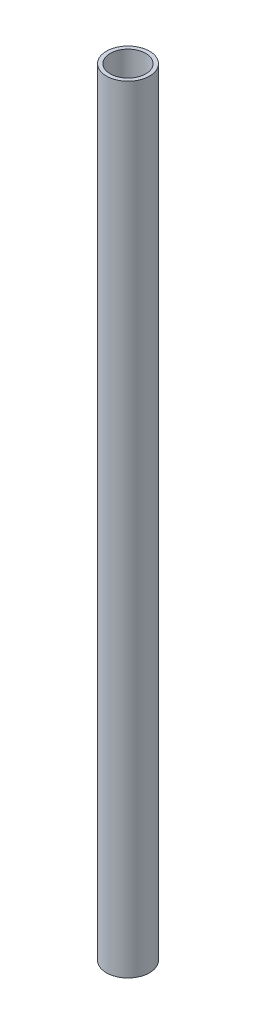
ISO-10303-21;
HEADER;
FILE_DESCRIPTION(('STEP AP214'),'2;1');
FILE_NAME('part.step','',(''),(''),'','','');
FILE_SCHEMA(('AUTOMOTIVE_DESIGN { 1 0 10303 214 1 1 1 1 }'));
ENDSEC;
DATA;
#1=APPLICATION_CONTEXT('core data for automotive mechanical design processes');
#2=APPLICATION_PROTOCOL_DEFINITION('international standard','automotive_design',2000,#1);
#3=PRODUCT_CONTEXT('',#1,'mechanical');
#4=PRODUCT('Part','Part','',(#3));
#5=PRODUCT_RELATED_PRODUCT_CATEGORY('part','',(#4));
#6=PRODUCT_DEFINITION_FORMATION('','',#4);
#7=PRODUCT_DEFINITION_CONTEXT('part definition',#1,'design');
#8=PRODUCT_DEFINITION('design','',#6,#7);
#9=PRODUCT_DEFINITION_SHAPE('','',#8);
#10=(LENGTH_UNIT() NAMED_UNIT(*) SI_UNIT(.MILLI.,.METRE.));
#11=(NAMED_UNIT(*) PLANE_ANGLE_UNIT() SI_UNIT($,.RADIAN.));
#12=(NAMED_UNIT(*) SI_UNIT($,.STERADIAN.) SOLID_ANGLE_UNIT());
#13=UNCERTAINTY_MEASURE_WITH_UNIT(LENGTH_MEASURE(1.E-05),#10,'distance_accuracy_value','');
#14=(GEOMETRIC_REPRESENTATION_CONTEXT(3) GLOBAL_UNCERTAINTY_ASSIGNED_CONTEXT((#13)) GLOBAL_UNIT_ASSIGNED_CONTEXT((#10,
#11,#12)) REPRESENTATION_CONTEXT('',''));
#15=CARTESIAN_POINT('',(0.,0.,0.));
#16=DIRECTION('',(0.,0.,1.));
#17=DIRECTION('',(1.,0.,0.));
#18=AXIS2_PLACEMENT_3D('',#15,#16,#17);
#19=CARTESIAN_POINT('',(0.,457.2,0.));
#20=DIRECTION('',(0.,1.,0.));
#21=DIRECTION('',(0.,0.,1.));
#22=AXIS2_PLACEMENT_3D('',#19,#20,#21);
#23=PLANE('',#22);
#24=CARTESIAN_POINT('',(0.,457.2,0.));
#25=DIRECTION('',(0.,1.,0.));
#26=DIRECTION('',(0.,0.,1.));
#27=AXIS2_PLACEMENT_3D('',#24,#25,#26);
#28=CIRCLE('',#27,12.7);
#29=CARTESIAN_POINT('',(0.,457.2,12.7));
#30=VERTEX_POINT('',#29);
#31=EDGE_CURVE('E10',#30,#30,#28,.T.);
#32=ORIENTED_EDGE('',*,*,#31,.T.);
#33=EDGE_LOOP('',(#32));
#34=FACE_BOUND('',#33,.T.);
#35=CARTESIAN_POINT('',(0.,457.2,0.));
#36=DIRECTION('',(0.,1.,0.));
#37=DIRECTION('',(0.,0.,1.));
#38=AXIS2_PLACEMENT_3D('',#35,#36,#37);
#39=CIRCLE('',#38,10.4648);
#40=CARTESIAN_POINT('',(0.,457.2,10.4648));
#41=VERTEX_POINT('',#40);
#42=EDGE_CURVE('E45',#41,#41,#39,.T.);
#43=ORIENTED_EDGE('',*,*,#42,.F.);
#44=EDGE_LOOP('',(#43));
#45=FACE_BOUND('',#44,.T.);
#46=ADVANCED_FACE('F34',(#34,#45),#23,.T.);
#47=CARTESIAN_POINT('',(0.,0.,0.));
#48=DIRECTION('',(0.,1.,0.));
#49=DIRECTION('',(0.,0.,1.));
#50=AXIS2_PLACEMENT_3D('',#47,#48,#49);
#51=PLANE('',#50);
#52=CARTESIAN_POINT('',(0.,0.,0.));
#53=DIRECTION('',(0.,1.,0.));
#54=DIRECTION('',(0.,0.,1.));
#55=AXIS2_PLACEMENT_3D('',#52,#53,#54);
#56=CIRCLE('',#55,12.7);
#57=CARTESIAN_POINT('',(0.,0.,12.7));
#58=VERTEX_POINT('',#57);
#59=EDGE_CURVE('E38',#58,#58,#56,.T.);
#60=ORIENTED_EDGE('',*,*,#59,.F.);
#61=EDGE_LOOP('',(#60));
#62=FACE_BOUND('',#61,.T.);
#63=CARTESIAN_POINT('',(0.,0.,0.));
#64=DIRECTION('',(0.,1.,0.));
#65=DIRECTION('',(0.,0.,1.));
#66=AXIS2_PLACEMENT_3D('',#63,#64,#65);
#67=CIRCLE('',#66,10.4648);
#68=CARTESIAN_POINT('',(0.,0.,10.4648));
#69=VERTEX_POINT('',#68);
#70=EDGE_CURVE('E47',#69,#69,#67,.T.);
#71=ORIENTED_EDGE('',*,*,#70,.T.);
#72=EDGE_LOOP('',(#71));
#73=FACE_BOUND('',#72,.T.);
#74=ADVANCED_FACE('F57',(#62,#73),#51,.F.);
#75=CARTESIAN_POINT('',(0.,457.2,0.));
#76=DIRECTION('',(0.,-1.,0.));
#77=DIRECTION('',(0.,0.,-1.));
#78=AXIS2_PLACEMENT_3D('',#75,#76,#77);
#79=CYLINDRICAL_SURFACE('',#78,12.7);
#80=ORIENTED_EDGE('',*,*,#31,.F.);
#81=EDGE_LOOP('',(#80));
#82=FACE_BOUND('',#81,.T.);
#83=ORIENTED_EDGE('',*,*,#59,.T.);
#84=EDGE_LOOP('',(#83));
#85=FACE_BOUND('',#84,.T.);
#86=ADVANCED_FACE('F36',(#82,#85),#79,.T.);
#87=CARTESIAN_POINT('',(0.,457.2,0.));
#88=DIRECTION('',(0.,-1.,0.));
#89=DIRECTION('',(0.,0.,-1.));
#90=AXIS2_PLACEMENT_3D('',#87,#88,#89);
#91=CYLINDRICAL_SURFACE('',#90,10.4648);
#92=ORIENTED_EDGE('',*,*,#42,.T.);
#93=EDGE_LOOP('',(#92));
#94=FACE_BOUND('',#93,.T.);
#95=ORIENTED_EDGE('',*,*,#70,.F.);
#96=EDGE_LOOP('',(#95));
#97=FACE_BOUND('',#96,.T.);
#98=ADVANCED_FACE('F53',(#94,#97),#91,.F.);
#99=CLOSED_SHELL('',(#46,#74,#86,#98));
#100=MANIFOLD_SOLID_BREP('B2',#99);
#101=ADVANCED_BREP_SHAPE_REPRESENTATION('',(#18,#100),#14);
#102=SHAPE_DEFINITION_REPRESENTATION(#9,#101);
ENDSEC;
END-ISO-10303-21;
